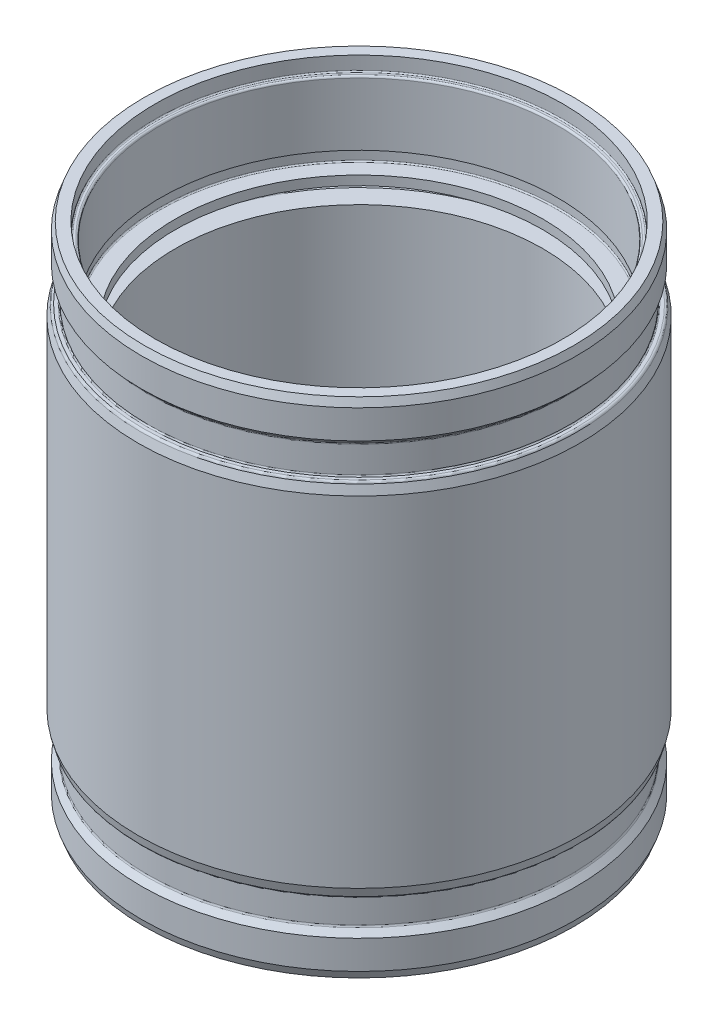
ISO-10303-21;
HEADER;
FILE_DESCRIPTION(('STEP AP214'),'2;1');
FILE_NAME('part.step','',(''),(''),'','','');
FILE_SCHEMA(('AUTOMOTIVE_DESIGN { 1 0 10303 214 1 1 1 1 }'));
ENDSEC;
DATA;
#1=APPLICATION_CONTEXT('core data for automotive mechanical design processes');
#2=APPLICATION_PROTOCOL_DEFINITION('international standard','automotive_design',2000,#1);
#3=PRODUCT_CONTEXT('',#1,'mechanical');
#4=PRODUCT('Part','Part','',(#3));
#5=PRODUCT_RELATED_PRODUCT_CATEGORY('part','',(#4));
#6=PRODUCT_DEFINITION_FORMATION('','',#4);
#7=PRODUCT_DEFINITION_CONTEXT('part definition',#1,'design');
#8=PRODUCT_DEFINITION('design','',#6,#7);
#9=PRODUCT_DEFINITION_SHAPE('','',#8);
#10=(LENGTH_UNIT() NAMED_UNIT(*) SI_UNIT(.MILLI.,.METRE.));
#11=(NAMED_UNIT(*) PLANE_ANGLE_UNIT() SI_UNIT($,.RADIAN.));
#12=(NAMED_UNIT(*) SI_UNIT($,.STERADIAN.) SOLID_ANGLE_UNIT());
#13=UNCERTAINTY_MEASURE_WITH_UNIT(LENGTH_MEASURE(1.E-05),#10,'distance_accuracy_value','');
#14=(GEOMETRIC_REPRESENTATION_CONTEXT(3) GLOBAL_UNCERTAINTY_ASSIGNED_CONTEXT((#13)) GLOBAL_UNIT_ASSIGNED_CONTEXT((#10,
#11,#12)) REPRESENTATION_CONTEXT('',''));
#15=CARTESIAN_POINT('',(0.,0.,0.));
#16=DIRECTION('',(0.,0.,1.));
#17=DIRECTION('',(1.,0.,0.));
#18=AXIS2_PLACEMENT_3D('',#15,#16,#17);
#19=CARTESIAN_POINT('',(0.,0.,0.));
#20=DIRECTION('',(0.,1.,0.));
#21=DIRECTION('',(0.,0.,1.));
#22=AXIS2_PLACEMENT_3D('',#19,#20,#21);
#23=CYLINDRICAL_SURFACE('',#22,59.5);
#24=CARTESIAN_POINT('',(0.,54.45,0.));
#25=DIRECTION('',(0.,1.,0.));
#26=DIRECTION('',(0.,0.,1.));
#27=AXIS2_PLACEMENT_3D('',#24,#25,#26);
#28=CIRCLE('',#27,59.5);
#29=CARTESIAN_POINT('',(0.,54.45,59.5));
#30=VERTEX_POINT('',#29);
#31=EDGE_CURVE('E106',#30,#30,#28,.T.);
#32=ORIENTED_EDGE('',*,*,#31,.F.);
#33=EDGE_LOOP('',(#32));
#34=FACE_BOUND('',#33,.T.);
#35=CARTESIAN_POINT('',(0.,57.45,0.));
#36=DIRECTION('',(0.,1.,0.));
#37=DIRECTION('',(0.,0.,1.));
#38=AXIS2_PLACEMENT_3D('',#35,#36,#37);
#39=CIRCLE('',#38,59.5);
#40=CARTESIAN_POINT('',(0.,57.45,59.5));
#41=VERTEX_POINT('',#40);
#42=EDGE_CURVE('E49',#41,#41,#39,.F.);
#43=ORIENTED_EDGE('',*,*,#42,.F.);
#44=EDGE_LOOP('',(#43));
#45=FACE_BOUND('',#44,.T.);
#46=ADVANCED_FACE('F45',(#34,#45),#23,.F.);
#47=CARTESIAN_POINT('',(59.5,86.5,0.));
#48=DIRECTION('',(0.,-1.,0.));
#49=DIRECTION('',(0.,0.,-1.));
#50=AXIS2_PLACEMENT_3D('',#47,#48,#49);
#51=PLANE('',#50);
#52=CARTESIAN_POINT('',(0.,86.5,0.));
#53=DIRECTION('',(0.,1.,0.));
#54=DIRECTION('',(0.,0.,1.));
#55=AXIS2_PLACEMENT_3D('',#52,#53,#54);
#56=CIRCLE('',#55,69.5789647888592);
#57=CARTESIAN_POINT('',(0.,86.5,69.5789647888592));
#58=VERTEX_POINT('',#57);
#59=EDGE_CURVE('E103',#58,#58,#56,.T.);
#60=ORIENTED_EDGE('',*,*,#59,.T.);
#61=EDGE_LOOP('',(#60));
#62=FACE_BOUND('',#61,.T.);
#63=CARTESIAN_POINT('',(0.,86.5,0.));
#64=DIRECTION('',(0.,1.,0.));
#65=DIRECTION('',(0.,0.,1.));
#66=AXIS2_PLACEMENT_3D('',#63,#64,#65);
#67=CIRCLE('',#66,66.);
#68=CARTESIAN_POINT('',(0.,86.5,66.));
#69=VERTEX_POINT('',#68);
#70=EDGE_CURVE('E772',#69,#69,#67,.T.);
#71=ORIENTED_EDGE('',*,*,#70,.F.);
#72=EDGE_LOOP('',(#71));
#73=FACE_BOUND('',#72,.T.);
#74=ADVANCED_FACE('F214',(#62,#73),#51,.F.);
#75=CARTESIAN_POINT('',(59.5,-76.5000000000001,0.));
#76=DIRECTION('',(0.,1.,0.));
#77=DIRECTION('',(0.,0.,1.));
#78=AXIS2_PLACEMENT_3D('',#75,#76,#77);
#79=PLANE('',#78);
#80=CARTESIAN_POINT('',(0.,-76.5000000000001,0.));
#81=DIRECTION('',(0.,1.,0.));
#82=DIRECTION('',(0.,0.,1.));
#83=AXIS2_PLACEMENT_3D('',#80,#81,#82);
#84=CIRCLE('',#83,69.5789647888592);
#85=CARTESIAN_POINT('',(0.,-76.5000000000001,69.5789647888592));
#86=VERTEX_POINT('',#85);
#87=EDGE_CURVE('E142',#86,#86,#84,.T.);
#88=ORIENTED_EDGE('',*,*,#87,.F.);
#89=EDGE_LOOP('',(#88));
#90=FACE_BOUND('',#89,.T.);
#91=CARTESIAN_POINT('',(0.,-76.5,0.));
#92=DIRECTION('',(0.,1.,0.));
#93=DIRECTION('',(0.,0.,1.));
#94=AXIS2_PLACEMENT_3D('',#91,#92,#93);
#95=CIRCLE('',#94,66.);
#96=CARTESIAN_POINT('',(0.,-76.5,66.));
#97=VERTEX_POINT('',#96);
#98=EDGE_CURVE('E218',#97,#97,#95,.T.);
#99=ORIENTED_EDGE('',*,*,#98,.T.);
#100=EDGE_LOOP('',(#99));
#101=FACE_BOUND('',#100,.T.);
#102=ADVANCED_FACE('F210',(#90,#101),#79,.F.);
#103=CARTESIAN_POINT('',(0.,0.,0.));
#104=DIRECTION('',(0.,1.,0.));
#105=DIRECTION('',(0.,0.,1.));
#106=AXIS2_PLACEMENT_3D('',#103,#104,#105);
#107=CYLINDRICAL_SURFACE('',#106,59.5);
#108=CARTESIAN_POINT('',(0.,-44.45,0.));
#109=DIRECTION('',(0.,1.,0.));
#110=DIRECTION('',(0.,0.,1.));
#111=AXIS2_PLACEMENT_3D('',#108,#109,#110);
#112=CIRCLE('',#111,59.5);
#113=CARTESIAN_POINT('',(0.,-44.45,59.5));
#114=VERTEX_POINT('',#113);
#115=EDGE_CURVE('E139',#114,#114,#112,.T.);
#116=ORIENTED_EDGE('',*,*,#115,.T.);
#117=EDGE_LOOP('',(#116));
#118=FACE_BOUND('',#117,.T.);
#119=CARTESIAN_POINT('',(0.,-47.45,0.));
#120=DIRECTION('',(0.,-1.,0.));
#121=DIRECTION('',(0.,0.,-1.));
#122=AXIS2_PLACEMENT_3D('',#119,#120,#121);
#123=CIRCLE('',#122,59.5);
#124=CARTESIAN_POINT('',(0.,-47.45,-59.5));
#125=VERTEX_POINT('',#124);
#126=EDGE_CURVE('E61',#125,#125,#123,.F.);
#127=ORIENTED_EDGE('',*,*,#126,.F.);
#128=EDGE_LOOP('',(#127));
#129=FACE_BOUND('',#128,.T.);
#130=ADVANCED_FACE('F213',(#118,#129),#107,.F.);
#131=CARTESIAN_POINT('',(0.,-52.857055236082,0.));
#132=DIRECTION('',(0.,1.,0.));
#133=DIRECTION('',(0.,0.,1.));
#134=AXIS2_PLACEMENT_3D('',#131,#132,#133);
#135=CONICAL_SURFACE('',#134,70.7386949873442,0.261799387799153);
#136=CARTESIAN_POINT('',(0.,-50.0158262487937,0.));
#137=DIRECTION('',(0.,1.,0.));
#138=DIRECTION('',(0.,0.,1.));
#139=AXIS2_PLACEMENT_3D('',#136,#137,#138);
#140=CIRCLE('',#139,71.5);
#141=CARTESIAN_POINT('',(0.,-50.0158262487937,71.5));
#142=VERTEX_POINT('',#141);
#143=EDGE_CURVE('E11',#142,#142,#140,.T.);
#144=ORIENTED_EDGE('',*,*,#143,.F.);
#145=EDGE_LOOP('',(#144));
#146=FACE_BOUND('',#145,.T.);
#147=CARTESIAN_POINT('',(0.,-52.857055236082,0.));
#148=DIRECTION('',(0.,1.,0.));
#149=DIRECTION('',(0.,0.,1.));
#150=AXIS2_PLACEMENT_3D('',#147,#148,#149);
#151=CIRCLE('',#150,70.7386949873442);
#152=CARTESIAN_POINT('',(0.,-52.857055236082,70.7386949873442));
#153=VERTEX_POINT('',#152);
#154=EDGE_CURVE('E53',#153,#153,#151,.T.);
#155=ORIENTED_EDGE('',*,*,#154,.T.);
#156=EDGE_LOOP('',(#155));
#157=FACE_BOUND('',#156,.T.);
#158=ADVANCED_FACE('F47',(#146,#157),#135,.T.);
#159=CARTESIAN_POINT('',(0.,-52.65,0.));
#160=DIRECTION('',(0.,1.,0.));
#161=DIRECTION('',(0.,0.,1.));
#162=AXIS2_PLACEMENT_3D('',#159,#160,#161);
#163=TOROIDAL_SURFACE('',#162,69.9659543263129,0.799999999999995);
#164=ORIENTED_EDGE('',*,*,#154,.F.);
#165=EDGE_LOOP('',(#164));
#166=FACE_BOUND('',#165,.T.);
#167=CARTESIAN_POINT('',(0.,-53.45,0.));
#168=DIRECTION('',(0.,1.,0.));
#169=DIRECTION('',(0.,0.,1.));
#170=AXIS2_PLACEMENT_3D('',#167,#168,#169);
#171=CIRCLE('',#170,69.9659543263129);
#172=CARTESIAN_POINT('',(0.,-53.45,69.9659543263129));
#173=VERTEX_POINT('',#172);
#174=EDGE_CURVE('E58',#173,#173,#171,.T.);
#175=ORIENTED_EDGE('',*,*,#174,.T.);
#176=EDGE_LOOP('',(#175));
#177=FACE_BOUND('',#176,.T.);
#178=ADVANCED_FACE('F165',(#166,#177),#163,.T.);
#179=CARTESIAN_POINT('',(69.9659543263129,-53.45,0.));
#180=DIRECTION('',(0.,1.,0.));
#181=DIRECTION('',(0.,0.,1.));
#182=AXIS2_PLACEMENT_3D('',#179,#180,#181);
#183=PLANE('',#182);
#184=ORIENTED_EDGE('',*,*,#174,.F.);
#185=EDGE_LOOP('',(#184));
#186=FACE_BOUND('',#185,.T.);
#187=CARTESIAN_POINT('',(0.,-53.45,0.));
#188=DIRECTION('',(0.,1.,0.));
#189=DIRECTION('',(0.,0.,1.));
#190=AXIS2_PLACEMENT_3D('',#187,#188,#189);
#191=CIRCLE('',#190,68.9);
#192=CARTESIAN_POINT('',(0.,-53.45,68.9));
#193=VERTEX_POINT('',#192);
#194=EDGE_CURVE('E160',#193,#193,#191,.T.);
#195=ORIENTED_EDGE('',*,*,#194,.T.);
#196=EDGE_LOOP('',(#195));
#197=FACE_BOUND('',#196,.T.);
#198=ADVANCED_FACE('F167',(#186,#197),#183,.F.);
#199=CARTESIAN_POINT('',(0.,-53.85,0.));
#200=DIRECTION('',(0.,1.,0.));
#201=DIRECTION('',(0.,0.,1.));
#202=AXIS2_PLACEMENT_3D('',#199,#200,#201);
#203=TOROIDAL_SURFACE('',#202,68.9,0.399999999999994);
#204=ORIENTED_EDGE('',*,*,#194,.F.);
#205=EDGE_LOOP('',(#204));
#206=FACE_BOUND('',#205,.T.);
#207=CARTESIAN_POINT('',(0.,-53.85,0.));
#208=DIRECTION('',(0.,1.,0.));
#209=DIRECTION('',(0.,0.,1.));
#210=AXIS2_PLACEMENT_3D('',#207,#208,#209);
#211=CIRCLE('',#210,68.5);
#212=CARTESIAN_POINT('',(0.,-53.85,68.5));
#213=VERTEX_POINT('',#212);
#214=EDGE_CURVE('E157',#213,#213,#211,.T.);
#215=ORIENTED_EDGE('',*,*,#214,.T.);
#216=EDGE_LOOP('',(#215));
#217=FACE_BOUND('',#216,.T.);
#218=ADVANCED_FACE('F170',(#206,#217),#203,.F.);
#219=CARTESIAN_POINT('',(0.,0.,0.));
#220=DIRECTION('',(0.,1.,0.));
#221=DIRECTION('',(0.,0.,1.));
#222=AXIS2_PLACEMENT_3D('',#219,#220,#221);
#223=CYLINDRICAL_SURFACE('',#222,68.5);
#224=ORIENTED_EDGE('',*,*,#214,.F.);
#225=EDGE_LOOP('',(#224));
#226=FACE_BOUND('',#225,.T.);
#227=CARTESIAN_POINT('',(0.,-62.436522368915,0.));
#228=DIRECTION('',(0.,1.,0.));
#229=DIRECTION('',(0.,0.,1.));
#230=AXIS2_PLACEMENT_3D('',#227,#228,#229);
#231=CIRCLE('',#230,68.5);
#232=CARTESIAN_POINT('',(0.,-62.436522368915,68.5));
#233=VERTEX_POINT('',#232);
#234=EDGE_CURVE('E154',#233,#233,#231,.T.);
#235=ORIENTED_EDGE('',*,*,#234,.T.);
#236=EDGE_LOOP('',(#235));
#237=FACE_BOUND('',#236,.T.);
#238=ADVANCED_FACE('F176',(#226,#237),#223,.T.);
#239=CARTESIAN_POINT('',(0.,-62.436522368915,0.));
#240=DIRECTION('',(0.,1.,0.));
#241=DIRECTION('',(0.,0.,1.));
#242=AXIS2_PLACEMENT_3D('',#239,#240,#241);
#243=TOROIDAL_SURFACE('',#242,69.3,0.799999999999998);
#244=ORIENTED_EDGE('',*,*,#234,.F.);
#245=EDGE_LOOP('',(#244));
#246=FACE_BOUND('',#245,.T.);
#247=CARTESIAN_POINT('',(0.,-63.0022077938642,0.));
#248=DIRECTION('',(0.,1.,0.));
#249=DIRECTION('',(0.,0.,1.));
#250=AXIS2_PLACEMENT_3D('',#247,#248,#249);
#251=CIRCLE('',#250,68.7343145750508);
#252=CARTESIAN_POINT('',(0.,-63.0022077938642,68.7343145750508));
#253=VERTEX_POINT('',#252);
#254=EDGE_CURVE('E151',#253,#253,#251,.T.);
#255=ORIENTED_EDGE('',*,*,#254,.T.);
#256=EDGE_LOOP('',(#255));
#257=FACE_BOUND('',#256,.T.);
#258=ADVANCED_FACE('F182',(#246,#257),#243,.F.);
#259=CARTESIAN_POINT('',(0.,-64.7428932188135,0.));
#260=DIRECTION('',(0.,-1.,0.));
#261=DIRECTION('',(0.,0.,-1.));
#262=AXIS2_PLACEMENT_3D('',#259,#260,#261);
#263=CONICAL_SURFACE('',#262,70.475,0.785398163397448);
#264=ORIENTED_EDGE('',*,*,#254,.F.);
#265=EDGE_LOOP('',(#264));
#266=FACE_BOUND('',#265,.T.);
#267=CARTESIAN_POINT('',(0.,-64.7428932188135,0.));
#268=DIRECTION('',(0.,1.,0.));
#269=DIRECTION('',(0.,0.,1.));
#270=AXIS2_PLACEMENT_3D('',#267,#268,#269);
#271=CIRCLE('',#270,70.475);
#272=CARTESIAN_POINT('',(0.,-64.7428932188135,70.475));
#273=VERTEX_POINT('',#272);
#274=EDGE_CURVE('E148',#273,#273,#271,.T.);
#275=ORIENTED_EDGE('',*,*,#274,.T.);
#276=EDGE_LOOP('',(#275));
#277=FACE_BOUND('',#276,.T.);
#278=ADVANCED_FACE('F188',(#266,#277),#263,.T.);
#279=CARTESIAN_POINT('',(0.,0.,0.));
#280=DIRECTION('',(0.,1.,0.));
#281=DIRECTION('',(0.,0.,1.));
#282=AXIS2_PLACEMENT_3D('',#279,#280,#281);
#283=CYLINDRICAL_SURFACE('',#282,70.475);
#284=ORIENTED_EDGE('',*,*,#274,.F.);
#285=EDGE_LOOP('',(#284));
#286=FACE_BOUND('',#285,.T.);
#287=CARTESIAN_POINT('',(0.,-74.0381634903542,0.));
#288=DIRECTION('',(0.,1.,0.));
#289=DIRECTION('',(0.,0.,1.));
#290=AXIS2_PLACEMENT_3D('',#287,#288,#289);
#291=CIRCLE('',#290,70.475);
#292=CARTESIAN_POINT('',(0.,-74.0381634903542,70.475));
#293=VERTEX_POINT('',#292);
#294=EDGE_CURVE('E145',#293,#293,#291,.T.);
#295=ORIENTED_EDGE('',*,*,#294,.T.);
#296=EDGE_LOOP('',(#295));
#297=FACE_BOUND('',#296,.T.);
#298=ADVANCED_FACE('F194',(#286,#297),#283,.T.);
#299=CARTESIAN_POINT('',(0.,-76.5000000000001,0.));
#300=DIRECTION('',(0.,1.,0.));
#301=DIRECTION('',(0.,0.,1.));
#302=AXIS2_PLACEMENT_3D('',#299,#300,#301);
#303=CONICAL_SURFACE('',#302,69.5789647888592,0.349065850398851);
#304=ORIENTED_EDGE('',*,*,#294,.F.);
#305=EDGE_LOOP('',(#304));
#306=FACE_BOUND('',#305,.T.);
#307=ORIENTED_EDGE('',*,*,#87,.T.);
#308=EDGE_LOOP('',(#307));
#309=FACE_BOUND('',#308,.T.);
#310=ADVANCED_FACE('F200',(#306,#309),#303,.T.);
#311=CARTESIAN_POINT('',(59.5,-44.45,0.));
#312=DIRECTION('',(0.,-1.,0.));
#313=DIRECTION('',(0.,0.,-1.));
#314=AXIS2_PLACEMENT_3D('',#311,#312,#313);
#315=PLANE('',#314);
#316=ORIENTED_EDGE('',*,*,#115,.F.);
#317=EDGE_LOOP('',(#316));
#318=FACE_BOUND('',#317,.T.);
#319=CARTESIAN_POINT('',(0.,-44.45,0.));
#320=DIRECTION('',(0.,1.,0.));
#321=DIRECTION('',(0.,0.,1.));
#322=AXIS2_PLACEMENT_3D('',#319,#320,#321);
#323=CIRCLE('',#322,66.25);
#324=CARTESIAN_POINT('',(0.,-44.45,66.25));
#325=VERTEX_POINT('',#324);
#326=EDGE_CURVE('E136',#325,#325,#323,.T.);
#327=ORIENTED_EDGE('',*,*,#326,.T.);
#328=EDGE_LOOP('',(#327));
#329=FACE_BOUND('',#328,.T.);
#330=ADVANCED_FACE('F206',(#318,#329),#315,.F.);
#331=CARTESIAN_POINT('',(0.,-43.65,0.));
#332=DIRECTION('',(0.,1.,0.));
#333=DIRECTION('',(0.,0.,1.));
#334=AXIS2_PLACEMENT_3D('',#331,#332,#333);
#335=TOROIDAL_SURFACE('',#334,66.25,0.799999999999999);
#336=ORIENTED_EDGE('',*,*,#326,.F.);
#337=EDGE_LOOP('',(#336));
#338=FACE_BOUND('',#337,.T.);
#339=CARTESIAN_POINT('',(0.,-43.65,0.));
#340=DIRECTION('',(0.,1.,0.));
#341=DIRECTION('',(0.,0.,1.));
#342=AXIS2_PLACEMENT_3D('',#339,#340,#341);
#343=CIRCLE('',#342,67.05);
#344=CARTESIAN_POINT('',(0.,-43.65,67.05));
#345=VERTEX_POINT('',#344);
#346=EDGE_CURVE('E133',#345,#345,#343,.T.);
#347=ORIENTED_EDGE('',*,*,#346,.T.);
#348=EDGE_LOOP('',(#347));
#349=FACE_BOUND('',#348,.T.);
#350=ADVANCED_FACE('F308',(#338,#349),#335,.F.);
#351=CARTESIAN_POINT('',(0.,0.,0.));
#352=DIRECTION('',(0.,1.,0.));
#353=DIRECTION('',(0.,0.,1.));
#354=AXIS2_PLACEMENT_3D('',#351,#352,#353);
#355=CYLINDRICAL_SURFACE('',#354,67.05);
#356=ORIENTED_EDGE('',*,*,#346,.F.);
#357=EDGE_LOOP('',(#356));
#358=FACE_BOUND('',#357,.T.);
#359=CARTESIAN_POINT('',(0.,-39.95,0.));
#360=DIRECTION('',(0.,1.,0.));
#361=DIRECTION('',(0.,0.,1.));
#362=AXIS2_PLACEMENT_3D('',#359,#360,#361);
#363=CIRCLE('',#362,67.05);
#364=CARTESIAN_POINT('',(0.,-39.95,67.05));
#365=VERTEX_POINT('',#364);
#366=EDGE_CURVE('E130',#365,#365,#363,.T.);
#367=ORIENTED_EDGE('',*,*,#366,.T.);
#368=EDGE_LOOP('',(#367));
#369=FACE_BOUND('',#368,.T.);
#370=ADVANCED_FACE('F304',(#358,#369),#355,.F.);
#371=CARTESIAN_POINT('',(0.,-39.95,0.));
#372=DIRECTION('',(0.,1.,0.));
#373=DIRECTION('',(0.,0.,1.));
#374=AXIS2_PLACEMENT_3D('',#371,#372,#373);
#375=TOROIDAL_SURFACE('',#374,66.25,0.799999999999999);
#376=ORIENTED_EDGE('',*,*,#366,.F.);
#377=EDGE_LOOP('',(#376));
#378=FACE_BOUND('',#377,.T.);
#379=CARTESIAN_POINT('',(0.,-39.15,0.));
#380=DIRECTION('',(0.,1.,0.));
#381=DIRECTION('',(0.,0.,1.));
#382=AXIS2_PLACEMENT_3D('',#379,#380,#381);
#383=CIRCLE('',#382,66.25);
#384=CARTESIAN_POINT('',(0.,-39.15,66.25));
#385=VERTEX_POINT('',#384);
#386=EDGE_CURVE('E127',#385,#385,#383,.T.);
#387=ORIENTED_EDGE('',*,*,#386,.T.);
#388=EDGE_LOOP('',(#387));
#389=FACE_BOUND('',#388,.T.);
#390=ADVANCED_FACE('F300',(#378,#389),#375,.F.);
#391=CARTESIAN_POINT('',(66.25,-39.15,0.));
#392=DIRECTION('',(0.,1.,0.));
#393=DIRECTION('',(0.,0.,1.));
#394=AXIS2_PLACEMENT_3D('',#391,#392,#393);
#395=PLANE('',#394);
#396=ORIENTED_EDGE('',*,*,#386,.F.);
#397=EDGE_LOOP('',(#396));
#398=FACE_BOUND('',#397,.T.);
#399=CARTESIAN_POINT('',(0.,-39.15,0.));
#400=DIRECTION('',(0.,1.,0.));
#401=DIRECTION('',(0.,0.,1.));
#402=AXIS2_PLACEMENT_3D('',#399,#400,#401);
#403=CIRCLE('',#402,59.5);
#404=CARTESIAN_POINT('',(0.,-39.15,59.5));
#405=VERTEX_POINT('',#404);
#406=EDGE_CURVE('E124',#405,#405,#403,.T.);
#407=ORIENTED_EDGE('',*,*,#406,.T.);
#408=EDGE_LOOP('',(#407));
#409=FACE_BOUND('',#408,.T.);
#410=ADVANCED_FACE('F296',(#398,#409),#395,.F.);
#411=CARTESIAN_POINT('',(0.,0.,0.));
#412=DIRECTION('',(0.,1.,0.));
#413=DIRECTION('',(0.,0.,1.));
#414=AXIS2_PLACEMENT_3D('',#411,#412,#413);
#415=CYLINDRICAL_SURFACE('',#414,59.5);
#416=ORIENTED_EDGE('',*,*,#406,.F.);
#417=EDGE_LOOP('',(#416));
#418=FACE_BOUND('',#417,.T.);
#419=CARTESIAN_POINT('',(0.,49.15,0.));
#420=DIRECTION('',(0.,1.,0.));
#421=DIRECTION('',(0.,0.,1.));
#422=AXIS2_PLACEMENT_3D('',#419,#420,#421);
#423=CIRCLE('',#422,59.5);
#424=CARTESIAN_POINT('',(0.,49.15,59.5));
#425=VERTEX_POINT('',#424);
#426=EDGE_CURVE('E121',#425,#425,#423,.T.);
#427=ORIENTED_EDGE('',*,*,#426,.T.);
#428=EDGE_LOOP('',(#427));
#429=FACE_BOUND('',#428,.T.);
#430=ADVANCED_FACE('F292',(#418,#429),#415,.F.);
#431=CARTESIAN_POINT('',(66.25,49.15,0.));
#432=DIRECTION('',(0.,-1.,0.));
#433=DIRECTION('',(0.,0.,-1.));
#434=AXIS2_PLACEMENT_3D('',#431,#432,#433);
#435=PLANE('',#434);
#436=ORIENTED_EDGE('',*,*,#426,.F.);
#437=EDGE_LOOP('',(#436));
#438=FACE_BOUND('',#437,.T.);
#439=CARTESIAN_POINT('',(0.,49.1499999999999,0.));
#440=DIRECTION('',(0.,1.,0.));
#441=DIRECTION('',(0.,0.,1.));
#442=AXIS2_PLACEMENT_3D('',#439,#440,#441);
#443=CIRCLE('',#442,66.25);
#444=CARTESIAN_POINT('',(0.,49.1499999999999,66.25));
#445=VERTEX_POINT('',#444);
#446=EDGE_CURVE('E118',#445,#445,#443,.T.);
#447=ORIENTED_EDGE('',*,*,#446,.T.);
#448=EDGE_LOOP('',(#447));
#449=FACE_BOUND('',#448,.T.);
#450=ADVANCED_FACE('F288',(#438,#449),#435,.F.);
#451=CARTESIAN_POINT('',(0.,49.9499999999999,0.));
#452=DIRECTION('',(0.,1.,0.));
#453=DIRECTION('',(0.,0.,1.));
#454=AXIS2_PLACEMENT_3D('',#451,#452,#453);
#455=TOROIDAL_SURFACE('',#454,66.25,0.799999999999999);
#456=ORIENTED_EDGE('',*,*,#446,.F.);
#457=EDGE_LOOP('',(#456));
#458=FACE_BOUND('',#457,.T.);
#459=CARTESIAN_POINT('',(0.,49.9499999999999,0.));
#460=DIRECTION('',(0.,1.,0.));
#461=DIRECTION('',(0.,0.,1.));
#462=AXIS2_PLACEMENT_3D('',#459,#460,#461);
#463=CIRCLE('',#462,67.05);
#464=CARTESIAN_POINT('',(0.,49.9499999999999,67.05));
#465=VERTEX_POINT('',#464);
#466=EDGE_CURVE('E115',#465,#465,#463,.T.);
#467=ORIENTED_EDGE('',*,*,#466,.T.);
#468=EDGE_LOOP('',(#467));
#469=FACE_BOUND('',#468,.T.);
#470=ADVANCED_FACE('F284',(#458,#469),#455,.F.);
#471=CARTESIAN_POINT('',(0.,0.,0.));
#472=DIRECTION('',(0.,1.,0.));
#473=DIRECTION('',(0.,0.,1.));
#474=AXIS2_PLACEMENT_3D('',#471,#472,#473);
#475=CYLINDRICAL_SURFACE('',#474,67.05);
#476=ORIENTED_EDGE('',*,*,#466,.F.);
#477=EDGE_LOOP('',(#476));
#478=FACE_BOUND('',#477,.T.);
#479=CARTESIAN_POINT('',(0.,53.6499999999999,0.));
#480=DIRECTION('',(0.,1.,0.));
#481=DIRECTION('',(0.,0.,1.));
#482=AXIS2_PLACEMENT_3D('',#479,#480,#481);
#483=CIRCLE('',#482,67.05);
#484=CARTESIAN_POINT('',(0.,53.6499999999999,67.05));
#485=VERTEX_POINT('',#484);
#486=EDGE_CURVE('E112',#485,#485,#483,.T.);
#487=ORIENTED_EDGE('',*,*,#486,.T.);
#488=EDGE_LOOP('',(#487));
#489=FACE_BOUND('',#488,.T.);
#490=ADVANCED_FACE('F280',(#478,#489),#475,.F.);
#491=CARTESIAN_POINT('',(0.,53.6499999999999,0.));
#492=DIRECTION('',(0.,1.,0.));
#493=DIRECTION('',(0.,0.,1.));
#494=AXIS2_PLACEMENT_3D('',#491,#492,#493);
#495=TOROIDAL_SURFACE('',#494,66.25,0.799999999999999);
#496=ORIENTED_EDGE('',*,*,#486,.F.);
#497=EDGE_LOOP('',(#496));
#498=FACE_BOUND('',#497,.T.);
#499=CARTESIAN_POINT('',(0.,54.4499999999999,0.));
#500=DIRECTION('',(0.,1.,0.));
#501=DIRECTION('',(0.,0.,1.));
#502=AXIS2_PLACEMENT_3D('',#499,#500,#501);
#503=CIRCLE('',#502,66.25);
#504=CARTESIAN_POINT('',(0.,54.4499999999999,66.25));
#505=VERTEX_POINT('',#504);
#506=EDGE_CURVE('E109',#505,#505,#503,.T.);
#507=ORIENTED_EDGE('',*,*,#506,.T.);
#508=EDGE_LOOP('',(#507));
#509=FACE_BOUND('',#508,.T.);
#510=ADVANCED_FACE('F276',(#498,#509),#495,.F.);
#511=CARTESIAN_POINT('',(59.5,54.45,0.));
#512=DIRECTION('',(0.,1.,0.));
#513=DIRECTION('',(0.,0.,1.));
#514=AXIS2_PLACEMENT_3D('',#511,#512,#513);
#515=PLANE('',#514);
#516=ORIENTED_EDGE('',*,*,#506,.F.);
#517=EDGE_LOOP('',(#516));
#518=FACE_BOUND('',#517,.T.);
#519=ORIENTED_EDGE('',*,*,#31,.T.);
#520=EDGE_LOOP('',(#519));
#521=FACE_BOUND('',#520,.T.);
#522=ADVANCED_FACE('F272',(#518,#521),#515,.F.);
#523=CARTESIAN_POINT('',(0.,84.0381634903543,0.));
#524=DIRECTION('',(0.,-1.,0.));
#525=DIRECTION('',(0.,0.,-1.));
#526=AXIS2_PLACEMENT_3D('',#523,#524,#525);
#527=CONICAL_SURFACE('',#526,70.475,0.349065850398841);
#528=ORIENTED_EDGE('',*,*,#59,.F.);
#529=EDGE_LOOP('',(#528));
#530=FACE_BOUND('',#529,.T.);
#531=CARTESIAN_POINT('',(0.,84.0381634903543,0.));
#532=DIRECTION('',(0.,1.,0.));
#533=DIRECTION('',(0.,0.,1.));
#534=AXIS2_PLACEMENT_3D('',#531,#532,#533);
#535=CIRCLE('',#534,70.475);
#536=CARTESIAN_POINT('',(0.,84.0381634903543,70.475));
#537=VERTEX_POINT('',#536);
#538=EDGE_CURVE('E100',#537,#537,#535,.T.);
#539=ORIENTED_EDGE('',*,*,#538,.T.);
#540=EDGE_LOOP('',(#539));
#541=FACE_BOUND('',#540,.T.);
#542=ADVANCED_FACE('F275',(#530,#541),#527,.T.);
#543=CARTESIAN_POINT('',(0.,0.,0.));
#544=DIRECTION('',(0.,1.,0.));
#545=DIRECTION('',(0.,0.,1.));
#546=AXIS2_PLACEMENT_3D('',#543,#544,#545);
#547=CYLINDRICAL_SURFACE('',#546,70.475);
#548=ORIENTED_EDGE('',*,*,#538,.F.);
#549=EDGE_LOOP('',(#548));
#550=FACE_BOUND('',#549,.T.);
#551=CARTESIAN_POINT('',(0.,74.7428932188134,0.));
#552=DIRECTION('',(0.,1.,0.));
#553=DIRECTION('',(0.,0.,1.));
#554=AXIS2_PLACEMENT_3D('',#551,#552,#553);
#555=CIRCLE('',#554,70.475);
#556=CARTESIAN_POINT('',(0.,74.7428932188134,70.475));
#557=VERTEX_POINT('',#556);
#558=EDGE_CURVE('E97',#557,#557,#555,.T.);
#559=ORIENTED_EDGE('',*,*,#558,.T.);
#560=EDGE_LOOP('',(#559));
#561=FACE_BOUND('',#560,.T.);
#562=ADVANCED_FACE('F453',(#550,#561),#547,.T.);
#563=CARTESIAN_POINT('',(0.,73.0022077938641,0.));
#564=DIRECTION('',(0.,1.,0.));
#565=DIRECTION('',(0.,0.,1.));
#566=AXIS2_PLACEMENT_3D('',#563,#564,#565);
#567=CONICAL_SURFACE('',#566,68.7343145750508,0.785398163397448);
#568=ORIENTED_EDGE('',*,*,#558,.F.);
#569=EDGE_LOOP('',(#568));
#570=FACE_BOUND('',#569,.T.);
#571=CARTESIAN_POINT('',(0.,73.0022077938641,0.));
#572=DIRECTION('',(0.,1.,0.));
#573=DIRECTION('',(0.,0.,1.));
#574=AXIS2_PLACEMENT_3D('',#571,#572,#573);
#575=CIRCLE('',#574,68.7343145750508);
#576=CARTESIAN_POINT('',(0.,73.0022077938641,68.7343145750508));
#577=VERTEX_POINT('',#576);
#578=EDGE_CURVE('E94',#577,#577,#575,.T.);
#579=ORIENTED_EDGE('',*,*,#578,.T.);
#580=EDGE_LOOP('',(#579));
#581=FACE_BOUND('',#580,.T.);
#582=ADVANCED_FACE('F462',(#570,#581),#567,.T.);
#583=CARTESIAN_POINT('',(0.,72.4365223689149,0.));
#584=DIRECTION('',(0.,1.,0.));
#585=DIRECTION('',(0.,0.,1.));
#586=AXIS2_PLACEMENT_3D('',#583,#584,#585);
#587=TOROIDAL_SURFACE('',#586,69.3,0.799999999999998);
#588=ORIENTED_EDGE('',*,*,#578,.F.);
#589=EDGE_LOOP('',(#588));
#590=FACE_BOUND('',#589,.T.);
#591=CARTESIAN_POINT('',(0.,72.4365223689149,0.));
#592=DIRECTION('',(0.,1.,0.));
#593=DIRECTION('',(0.,0.,1.));
#594=AXIS2_PLACEMENT_3D('',#591,#592,#593);
#595=CIRCLE('',#594,68.5);
#596=CARTESIAN_POINT('',(0.,72.4365223689149,68.5));
#597=VERTEX_POINT('',#596);
#598=EDGE_CURVE('E91',#597,#597,#595,.T.);
#599=ORIENTED_EDGE('',*,*,#598,.T.);
#600=EDGE_LOOP('',(#599));
#601=FACE_BOUND('',#600,.T.);
#602=ADVANCED_FACE('F475',(#590,#601),#587,.F.);
#603=CARTESIAN_POINT('',(0.,0.,0.));
#604=DIRECTION('',(0.,1.,0.));
#605=DIRECTION('',(0.,0.,1.));
#606=AXIS2_PLACEMENT_3D('',#603,#604,#605);
#607=CYLINDRICAL_SURFACE('',#606,68.5);
#608=ORIENTED_EDGE('',*,*,#598,.F.);
#609=EDGE_LOOP('',(#608));
#610=FACE_BOUND('',#609,.T.);
#611=CARTESIAN_POINT('',(0.,63.8499999999999,0.));
#612=DIRECTION('',(0.,1.,0.));
#613=DIRECTION('',(0.,0.,1.));
#614=AXIS2_PLACEMENT_3D('',#611,#612,#613);
#615=CIRCLE('',#614,68.5);
#616=CARTESIAN_POINT('',(0.,63.8499999999999,68.5));
#617=VERTEX_POINT('',#616);
#618=EDGE_CURVE('E88',#617,#617,#615,.T.);
#619=ORIENTED_EDGE('',*,*,#618,.T.);
#620=EDGE_LOOP('',(#619));
#621=FACE_BOUND('',#620,.T.);
#622=ADVANCED_FACE('F485',(#610,#621),#607,.T.);
#623=CARTESIAN_POINT('',(0.,63.8499999999999,0.));
#624=DIRECTION('',(0.,1.,0.));
#625=DIRECTION('',(0.,0.,1.));
#626=AXIS2_PLACEMENT_3D('',#623,#624,#625);
#627=TOROIDAL_SURFACE('',#626,68.9,0.399999999999998);
#628=ORIENTED_EDGE('',*,*,#618,.F.);
#629=EDGE_LOOP('',(#628));
#630=FACE_BOUND('',#629,.T.);
#631=CARTESIAN_POINT('',(0.,63.4499999999999,0.));
#632=DIRECTION('',(0.,1.,0.));
#633=DIRECTION('',(0.,0.,1.));
#634=AXIS2_PLACEMENT_3D('',#631,#632,#633);
#635=CIRCLE('',#634,68.9);
#636=CARTESIAN_POINT('',(0.,63.4499999999999,68.9));
#637=VERTEX_POINT('',#636);
#638=EDGE_CURVE('E85',#637,#637,#635,.T.);
#639=ORIENTED_EDGE('',*,*,#638,.T.);
#640=EDGE_LOOP('',(#639));
#641=FACE_BOUND('',#640,.T.);
#642=ADVANCED_FACE('F495',(#630,#641),#627,.F.);
#643=CARTESIAN_POINT('',(69.9659543263129,63.4499999999999,0.));
#644=DIRECTION('',(0.,-1.,0.));
#645=DIRECTION('',(0.,0.,-1.));
#646=AXIS2_PLACEMENT_3D('',#643,#644,#645);
#647=PLANE('',#646);
#648=ORIENTED_EDGE('',*,*,#638,.F.);
#649=EDGE_LOOP('',(#648));
#650=FACE_BOUND('',#649,.T.);
#651=CARTESIAN_POINT('',(0.,63.4499999999999,0.));
#652=DIRECTION('',(0.,1.,0.));
#653=DIRECTION('',(0.,0.,1.));
#654=AXIS2_PLACEMENT_3D('',#651,#652,#653);
#655=CIRCLE('',#654,69.9659543263129);
#656=CARTESIAN_POINT('',(0.,63.4499999999999,69.9659543263129));
#657=VERTEX_POINT('',#656);
#658=EDGE_CURVE('E82',#657,#657,#655,.T.);
#659=ORIENTED_EDGE('',*,*,#658,.T.);
#660=EDGE_LOOP('',(#659));
#661=FACE_BOUND('',#660,.T.);
#662=ADVANCED_FACE('F505',(#650,#661),#647,.F.);
#663=CARTESIAN_POINT('',(0.,62.6499999999999,0.));
#664=DIRECTION('',(0.,1.,0.));
#665=DIRECTION('',(0.,0.,1.));
#666=AXIS2_PLACEMENT_3D('',#663,#664,#665);
#667=TOROIDAL_SURFACE('',#666,69.9659543263129,0.800000000000029);
#668=ORIENTED_EDGE('',*,*,#658,.F.);
#669=EDGE_LOOP('',(#668));
#670=FACE_BOUND('',#669,.T.);
#671=CARTESIAN_POINT('',(0.,62.8570552360821,0.));
#672=DIRECTION('',(0.,1.,0.));
#673=DIRECTION('',(0.,0.,1.));
#674=AXIS2_PLACEMENT_3D('',#671,#672,#673);
#675=CIRCLE('',#674,70.7386949873442);
#676=CARTESIAN_POINT('',(0.,62.8570552360821,70.7386949873442));
#677=VERTEX_POINT('',#676);
#678=EDGE_CURVE('E68',#677,#677,#675,.T.);
#679=ORIENTED_EDGE('',*,*,#678,.T.);
#680=EDGE_LOOP('',(#679));
#681=FACE_BOUND('',#680,.T.);
#682=ADVANCED_FACE('F515',(#670,#681),#667,.T.);
#683=CARTESIAN_POINT('',(0.,60.0158262487937,0.));
#684=DIRECTION('',(0.,-1.,0.));
#685=DIRECTION('',(0.,0.,-1.));
#686=AXIS2_PLACEMENT_3D('',#683,#684,#685);
#687=CONICAL_SURFACE('',#686,71.5,0.261799387799148);
#688=ORIENTED_EDGE('',*,*,#678,.F.);
#689=EDGE_LOOP('',(#688));
#690=FACE_BOUND('',#689,.T.);
#691=CARTESIAN_POINT('',(0.,60.0158262487937,0.));
#692=DIRECTION('',(0.,1.,0.));
#693=DIRECTION('',(0.,0.,1.));
#694=AXIS2_PLACEMENT_3D('',#691,#692,#693);
#695=CIRCLE('',#694,71.5);
#696=CARTESIAN_POINT('',(0.,60.0158262487937,71.5));
#697=VERTEX_POINT('',#696);
#698=EDGE_CURVE('E63',#697,#697,#695,.T.);
#699=ORIENTED_EDGE('',*,*,#698,.T.);
#700=EDGE_LOOP('',(#699));
#701=FACE_BOUND('',#700,.T.);
#702=ADVANCED_FACE('F525',(#690,#701),#687,.T.);
#703=CARTESIAN_POINT('',(0.,0.,0.));
#704=DIRECTION('',(0.,1.,0.));
#705=DIRECTION('',(0.,0.,1.));
#706=AXIS2_PLACEMENT_3D('',#703,#704,#705);
#707=CYLINDRICAL_SURFACE('',#706,71.5);
#708=ORIENTED_EDGE('',*,*,#698,.F.);
#709=EDGE_LOOP('',(#708));
#710=FACE_BOUND('',#709,.T.);
#711=ORIENTED_EDGE('',*,*,#143,.T.);
#712=EDGE_LOOP('',(#711));
#713=FACE_BOUND('',#712,.T.);
#714=ADVANCED_FACE('F535',(#710,#713),#707,.T.);
#715=CARTESIAN_POINT('',(58.8156371003785,-47.45,0.));
#716=DIRECTION('',(0.,-1.,0.));
#717=DIRECTION('',(0.,0.,-1.));
#718=AXIS2_PLACEMENT_3D('',#715,#716,#717);
#719=PLANE('',#718);
#720=CARTESIAN_POINT('',(0.,-47.45,0.));
#721=DIRECTION('',(0.,1.,0.));
#722=DIRECTION('',(0.,0.,1.));
#723=AXIS2_PLACEMENT_3D('',#720,#721,#722);
#724=CIRCLE('',#723,64.5);
#725=CARTESIAN_POINT('',(0.,-47.45,64.5));
#726=VERTEX_POINT('',#725);
#727=EDGE_CURVE('E64',#726,#726,#724,.T.);
#728=ORIENTED_EDGE('',*,*,#727,.F.);
#729=EDGE_LOOP('',(#728));
#730=FACE_BOUND('',#729,.T.);
#731=ORIENTED_EDGE('',*,*,#126,.T.);
#732=EDGE_LOOP('',(#731));
#733=FACE_BOUND('',#732,.T.);
#734=ADVANCED_FACE('F257',(#730,#733),#719,.T.);
#735=CARTESIAN_POINT('',(0.,-47.85,0.));
#736=DIRECTION('',(0.,1.,0.));
#737=DIRECTION('',(0.,0.,1.));
#738=AXIS2_PLACEMENT_3D('',#735,#736,#737);
#739=TOROIDAL_SURFACE('',#738,64.5,0.399999999999998);
#740=ORIENTED_EDGE('',*,*,#727,.T.);
#741=EDGE_LOOP('',(#740));
#742=FACE_BOUND('',#741,.T.);
#743=CARTESIAN_POINT('',(0.,-47.85,0.));
#744=DIRECTION('',(0.,1.,0.));
#745=DIRECTION('',(0.,0.,1.));
#746=AXIS2_PLACEMENT_3D('',#743,#744,#745);
#747=CIRCLE('',#746,64.9);
#748=CARTESIAN_POINT('',(0.,-47.85,64.9));
#749=VERTEX_POINT('',#748);
#750=EDGE_CURVE('E71',#749,#749,#747,.T.);
#751=ORIENTED_EDGE('',*,*,#750,.F.);
#752=EDGE_LOOP('',(#751));
#753=FACE_BOUND('',#752,.T.);
#754=ADVANCED_FACE('F248',(#742,#753),#739,.F.);
#755=CARTESIAN_POINT('',(0.,0.,0.));
#756=DIRECTION('',(0.,1.,0.));
#757=DIRECTION('',(0.,0.,1.));
#758=AXIS2_PLACEMENT_3D('',#755,#756,#757);
#759=CYLINDRICAL_SURFACE('',#758,64.9);
#760=ORIENTED_EDGE('',*,*,#750,.T.);
#761=EDGE_LOOP('',(#760));
#762=FACE_BOUND('',#761,.T.);
#763=CARTESIAN_POINT('',(0.,-51.,0.));
#764=DIRECTION('',(0.,1.,0.));
#765=DIRECTION('',(0.,0.,1.));
#766=AXIS2_PLACEMENT_3D('',#763,#764,#765);
#767=CIRCLE('',#766,64.9);
#768=CARTESIAN_POINT('',(0.,-51.,64.9));
#769=VERTEX_POINT('',#768);
#770=EDGE_CURVE('E76',#769,#769,#767,.T.);
#771=ORIENTED_EDGE('',*,*,#770,.F.);
#772=EDGE_LOOP('',(#771));
#773=FACE_BOUND('',#772,.T.);
#774=ADVANCED_FACE('F246',(#762,#773),#759,.F.);
#775=CARTESIAN_POINT('',(64.3,-51.,0.));
#776=DIRECTION('',(0.,1.,0.));
#777=DIRECTION('',(0.,0.,1.));
#778=AXIS2_PLACEMENT_3D('',#775,#776,#777);
#779=PLANE('',#778);
#780=ORIENTED_EDGE('',*,*,#770,.T.);
#781=EDGE_LOOP('',(#780));
#782=FACE_BOUND('',#781,.T.);
#783=CARTESIAN_POINT('',(0.,-51.,0.));
#784=DIRECTION('',(0.,1.,0.));
#785=DIRECTION('',(0.,0.,1.));
#786=AXIS2_PLACEMENT_3D('',#783,#784,#785);
#787=CIRCLE('',#786,64.3);
#788=CARTESIAN_POINT('',(0.,-51.,64.3));
#789=VERTEX_POINT('',#788);
#790=EDGE_CURVE('E238',#789,#789,#787,.T.);
#791=ORIENTED_EDGE('',*,*,#790,.F.);
#792=EDGE_LOOP('',(#791));
#793=FACE_BOUND('',#792,.T.);
#794=ADVANCED_FACE('F243',(#782,#793),#779,.T.);
#795=CARTESIAN_POINT('',(0.,0.,0.));
#796=DIRECTION('',(0.,1.,0.));
#797=DIRECTION('',(0.,0.,1.));
#798=AXIS2_PLACEMENT_3D('',#795,#796,#797);
#799=CYLINDRICAL_SURFACE('',#798,64.3);
#800=ORIENTED_EDGE('',*,*,#790,.T.);
#801=EDGE_LOOP('',(#800));
#802=FACE_BOUND('',#801,.T.);
#803=CARTESIAN_POINT('',(0.,-71.25,0.));
#804=DIRECTION('',(0.,1.,0.));
#805=DIRECTION('',(0.,0.,1.));
#806=AXIS2_PLACEMENT_3D('',#803,#804,#805);
#807=CIRCLE('',#806,64.3);
#808=CARTESIAN_POINT('',(0.,-71.25,64.3));
#809=VERTEX_POINT('',#808);
#810=EDGE_CURVE('E235',#809,#809,#807,.T.);
#811=ORIENTED_EDGE('',*,*,#810,.F.);
#812=EDGE_LOOP('',(#811));
#813=FACE_BOUND('',#812,.T.);
#814=ADVANCED_FACE('F255',(#802,#813),#799,.F.);
#815=CARTESIAN_POINT('',(0.,-71.25,0.));
#816=DIRECTION('',(0.,1.,0.));
#817=DIRECTION('',(0.,0.,1.));
#818=AXIS2_PLACEMENT_3D('',#815,#816,#817);
#819=TOROIDAL_SURFACE('',#818,64.9,0.600000000000003);
#820=ORIENTED_EDGE('',*,*,#810,.T.);
#821=EDGE_LOOP('',(#820));
#822=FACE_BOUND('',#821,.T.);
#823=CARTESIAN_POINT('',(0.,-71.85,0.));
#824=DIRECTION('',(0.,1.,0.));
#825=DIRECTION('',(0.,0.,1.));
#826=AXIS2_PLACEMENT_3D('',#823,#824,#825);
#827=CIRCLE('',#826,64.9);
#828=CARTESIAN_POINT('',(0.,-71.85,64.9));
#829=VERTEX_POINT('',#828);
#830=EDGE_CURVE('E232',#829,#829,#827,.T.);
#831=ORIENTED_EDGE('',*,*,#830,.F.);
#832=EDGE_LOOP('',(#831));
#833=FACE_BOUND('',#832,.T.);
#834=ADVANCED_FACE('F603',(#822,#833),#819,.T.);
#835=CARTESIAN_POINT('',(64.9,-71.85,0.));
#836=DIRECTION('',(0.,-1.,0.));
#837=DIRECTION('',(0.,0.,-1.));
#838=AXIS2_PLACEMENT_3D('',#835,#836,#837);
#839=PLANE('',#838);
#840=ORIENTED_EDGE('',*,*,#830,.T.);
#841=EDGE_LOOP('',(#840));
#842=FACE_BOUND('',#841,.T.);
#843=CARTESIAN_POINT('',(0.,-71.85,0.));
#844=DIRECTION('',(0.,1.,0.));
#845=DIRECTION('',(0.,0.,1.));
#846=AXIS2_PLACEMENT_3D('',#843,#844,#845);
#847=CIRCLE('',#846,65.6);
#848=CARTESIAN_POINT('',(0.,-71.85,65.6));
#849=VERTEX_POINT('',#848);
#850=EDGE_CURVE('E223',#849,#849,#847,.T.);
#851=ORIENTED_EDGE('',*,*,#850,.F.);
#852=EDGE_LOOP('',(#851));
#853=FACE_BOUND('',#852,.T.);
#854=ADVANCED_FACE('F619',(#842,#853),#839,.T.);
#855=CARTESIAN_POINT('',(0.,-72.25,0.));
#856=DIRECTION('',(0.,1.,0.));
#857=DIRECTION('',(0.,0.,1.));
#858=AXIS2_PLACEMENT_3D('',#855,#856,#857);
#859=TOROIDAL_SURFACE('',#858,65.6,0.399999999999998);
#860=ORIENTED_EDGE('',*,*,#850,.T.);
#861=EDGE_LOOP('',(#860));
#862=FACE_BOUND('',#861,.T.);
#863=CARTESIAN_POINT('',(0.,-72.25,0.));
#864=DIRECTION('',(0.,1.,0.));
#865=DIRECTION('',(0.,0.,1.));
#866=AXIS2_PLACEMENT_3D('',#863,#864,#865);
#867=CIRCLE('',#866,66.);
#868=CARTESIAN_POINT('',(0.,-72.25,66.));
#869=VERTEX_POINT('',#868);
#870=EDGE_CURVE('E220',#869,#869,#867,.T.);
#871=ORIENTED_EDGE('',*,*,#870,.F.);
#872=EDGE_LOOP('',(#871));
#873=FACE_BOUND('',#872,.T.);
#874=ADVANCED_FACE('F629',(#862,#873),#859,.F.);
#875=CARTESIAN_POINT('',(0.,0.,0.));
#876=DIRECTION('',(0.,1.,0.));
#877=DIRECTION('',(0.,0.,1.));
#878=AXIS2_PLACEMENT_3D('',#875,#876,#877);
#879=CYLINDRICAL_SURFACE('',#878,66.);
#880=ORIENTED_EDGE('',*,*,#870,.T.);
#881=EDGE_LOOP('',(#880));
#882=FACE_BOUND('',#881,.T.);
#883=ORIENTED_EDGE('',*,*,#98,.F.);
#884=EDGE_LOOP('',(#883));
#885=FACE_BOUND('',#884,.T.);
#886=ADVANCED_FACE('F639',(#882,#885),#879,.F.);
#887=CARTESIAN_POINT('',(58.8156371003785,57.45,0.));
#888=DIRECTION('',(0.,1.,0.));
#889=DIRECTION('',(0.,0.,1.));
#890=AXIS2_PLACEMENT_3D('',#887,#888,#889);
#891=PLANE('',#890);
#892=CARTESIAN_POINT('',(0.,57.45,0.));
#893=DIRECTION('',(0.,1.,0.));
#894=DIRECTION('',(0.,0.,1.));
#895=AXIS2_PLACEMENT_3D('',#892,#893,#894);
#896=CIRCLE('',#895,64.5);
#897=CARTESIAN_POINT('',(0.,57.45,64.5));
#898=VERTEX_POINT('',#897);
#899=EDGE_CURVE('E770',#898,#898,#896,.T.);
#900=ORIENTED_EDGE('',*,*,#899,.T.);
#901=EDGE_LOOP('',(#900));
#902=FACE_BOUND('',#901,.T.);
#903=ORIENTED_EDGE('',*,*,#42,.T.);
#904=EDGE_LOOP('',(#903));
#905=FACE_BOUND('',#904,.T.);
#906=ADVANCED_FACE('F649',(#902,#905),#891,.T.);
#907=CARTESIAN_POINT('',(0.,82.25,0.));
#908=DIRECTION('',(0.,1.,0.));
#909=DIRECTION('',(0.,0.,1.));
#910=AXIS2_PLACEMENT_3D('',#907,#908,#909);
#911=TOROIDAL_SURFACE('',#910,65.6,0.400000000000011);
#912=CARTESIAN_POINT('',(0.,82.25,0.));
#913=DIRECTION('',(0.,1.,0.));
#914=DIRECTION('',(0.,0.,1.));
#915=AXIS2_PLACEMENT_3D('',#912,#913,#914);
#916=CIRCLE('',#915,66.);
#917=CARTESIAN_POINT('',(0.,82.25,66.));
#918=VERTEX_POINT('',#917);
#919=EDGE_CURVE('E226',#918,#918,#916,.T.);
#920=ORIENTED_EDGE('',*,*,#919,.T.);
#921=EDGE_LOOP('',(#920));
#922=FACE_BOUND('',#921,.T.);
#923=CARTESIAN_POINT('',(0.,81.85,0.));
#924=DIRECTION('',(0.,1.,0.));
#925=DIRECTION('',(0.,0.,1.));
#926=AXIS2_PLACEMENT_3D('',#923,#924,#925);
#927=CIRCLE('',#926,65.6);
#928=CARTESIAN_POINT('',(0.,81.85,65.6));
#929=VERTEX_POINT('',#928);
#930=EDGE_CURVE('E751',#929,#929,#927,.T.);
#931=ORIENTED_EDGE('',*,*,#930,.F.);
#932=EDGE_LOOP('',(#931));
#933=FACE_BOUND('',#932,.T.);
#934=ADVANCED_FACE('F659',(#922,#933),#911,.F.);
#935=CARTESIAN_POINT('',(0.,0.,0.));
#936=DIRECTION('',(0.,1.,0.));
#937=DIRECTION('',(0.,0.,1.));
#938=AXIS2_PLACEMENT_3D('',#935,#936,#937);
#939=CYLINDRICAL_SURFACE('',#938,66.);
#940=ORIENTED_EDGE('',*,*,#70,.T.);
#941=EDGE_LOOP('',(#940));
#942=FACE_BOUND('',#941,.T.);
#943=ORIENTED_EDGE('',*,*,#919,.F.);
#944=EDGE_LOOP('',(#943));
#945=FACE_BOUND('',#944,.T.);
#946=ADVANCED_FACE('F669',(#942,#945),#939,.F.);
#947=CARTESIAN_POINT('',(0.,57.85,0.));
#948=DIRECTION('',(0.,1.,0.));
#949=DIRECTION('',(0.,0.,1.));
#950=AXIS2_PLACEMENT_3D('',#947,#948,#949);
#951=TOROIDAL_SURFACE('',#950,64.5,0.399999999999998);
#952=CARTESIAN_POINT('',(0.,57.85,0.));
#953=DIRECTION('',(0.,1.,0.));
#954=DIRECTION('',(0.,0.,1.));
#955=AXIS2_PLACEMENT_3D('',#952,#953,#954);
#956=CIRCLE('',#955,64.9);
#957=CARTESIAN_POINT('',(0.,57.85,64.9));
#958=VERTEX_POINT('',#957);
#959=EDGE_CURVE('E767',#958,#958,#956,.T.);
#960=ORIENTED_EDGE('',*,*,#959,.T.);
#961=EDGE_LOOP('',(#960));
#962=FACE_BOUND('',#961,.T.);
#963=ORIENTED_EDGE('',*,*,#899,.F.);
#964=EDGE_LOOP('',(#963));
#965=FACE_BOUND('',#964,.T.);
#966=ADVANCED_FACE('F679',(#962,#965),#951,.F.);
#967=CARTESIAN_POINT('',(0.,0.,0.));
#968=DIRECTION('',(0.,1.,0.));
#969=DIRECTION('',(0.,0.,1.));
#970=AXIS2_PLACEMENT_3D('',#967,#968,#969);
#971=CYLINDRICAL_SURFACE('',#970,64.9);
#972=CARTESIAN_POINT('',(0.,61.,0.));
#973=DIRECTION('',(0.,1.,0.));
#974=DIRECTION('',(0.,0.,1.));
#975=AXIS2_PLACEMENT_3D('',#972,#973,#974);
#976=CIRCLE('',#975,64.9);
#977=CARTESIAN_POINT('',(0.,61.,64.9));
#978=VERTEX_POINT('',#977);
#979=EDGE_CURVE('E764',#978,#978,#976,.T.);
#980=ORIENTED_EDGE('',*,*,#979,.T.);
#981=EDGE_LOOP('',(#980));
#982=FACE_BOUND('',#981,.T.);
#983=ORIENTED_EDGE('',*,*,#959,.F.);
#984=EDGE_LOOP('',(#983));
#985=FACE_BOUND('',#984,.T.);
#986=ADVANCED_FACE('F689',(#982,#985),#971,.F.);
#987=CARTESIAN_POINT('',(64.3,61.,0.));
#988=DIRECTION('',(0.,-1.,0.));
#989=DIRECTION('',(0.,0.,-1.));
#990=AXIS2_PLACEMENT_3D('',#987,#988,#989);
#991=PLANE('',#990);
#992=CARTESIAN_POINT('',(0.,61.,0.));
#993=DIRECTION('',(0.,1.,0.));
#994=DIRECTION('',(0.,0.,1.));
#995=AXIS2_PLACEMENT_3D('',#992,#993,#994);
#996=CIRCLE('',#995,64.3);
#997=CARTESIAN_POINT('',(0.,61.,64.3));
#998=VERTEX_POINT('',#997);
#999=EDGE_CURVE('E758',#998,#998,#996,.T.);
#1000=ORIENTED_EDGE('',*,*,#999,.T.);
#1001=EDGE_LOOP('',(#1000));
#1002=FACE_BOUND('',#1001,.T.);
#1003=ORIENTED_EDGE('',*,*,#979,.F.);
#1004=EDGE_LOOP('',(#1003));
#1005=FACE_BOUND('',#1004,.T.);
#1006=ADVANCED_FACE('F699',(#1002,#1005),#991,.T.);
#1007=CARTESIAN_POINT('',(0.,0.,0.));
#1008=DIRECTION('',(0.,1.,0.));
#1009=DIRECTION('',(0.,0.,1.));
#1010=AXIS2_PLACEMENT_3D('',#1007,#1008,#1009);
#1011=CYLINDRICAL_SURFACE('',#1010,64.3);
#1012=CARTESIAN_POINT('',(0.,81.25,0.));
#1013=DIRECTION('',(0.,1.,0.));
#1014=DIRECTION('',(0.,0.,1.));
#1015=AXIS2_PLACEMENT_3D('',#1012,#1013,#1014);
#1016=CIRCLE('',#1015,64.3);
#1017=CARTESIAN_POINT('',(0.,81.25,64.3));
#1018=VERTEX_POINT('',#1017);
#1019=EDGE_CURVE('E755',#1018,#1018,#1016,.T.);
#1020=ORIENTED_EDGE('',*,*,#1019,.T.);
#1021=EDGE_LOOP('',(#1020));
#1022=FACE_BOUND('',#1021,.T.);
#1023=ORIENTED_EDGE('',*,*,#999,.F.);
#1024=EDGE_LOOP('',(#1023));
#1025=FACE_BOUND('',#1024,.T.);
#1026=ADVANCED_FACE('F709',(#1022,#1025),#1011,.F.);
#1027=CARTESIAN_POINT('',(0.,81.25,0.));
#1028=DIRECTION('',(0.,1.,0.));
#1029=DIRECTION('',(0.,0.,1.));
#1030=AXIS2_PLACEMENT_3D('',#1027,#1028,#1029);
#1031=TOROIDAL_SURFACE('',#1030,64.9,0.599999999999989);
#1032=CARTESIAN_POINT('',(0.,81.85,0.));
#1033=DIRECTION('',(0.,1.,0.));
#1034=DIRECTION('',(0.,0.,1.));
#1035=AXIS2_PLACEMENT_3D('',#1032,#1033,#1034);
#1036=CIRCLE('',#1035,64.9);
#1037=CARTESIAN_POINT('',(0.,81.85,64.9));
#1038=VERTEX_POINT('',#1037);
#1039=EDGE_CURVE('E754',#1038,#1038,#1036,.T.);
#1040=ORIENTED_EDGE('',*,*,#1039,.T.);
#1041=EDGE_LOOP('',(#1040));
#1042=FACE_BOUND('',#1041,.T.);
#1043=ORIENTED_EDGE('',*,*,#1019,.F.);
#1044=EDGE_LOOP('',(#1043));
#1045=FACE_BOUND('',#1044,.T.);
#1046=ADVANCED_FACE('F719',(#1042,#1045),#1031,.T.);
#1047=CARTESIAN_POINT('',(64.9,81.85,0.));
#1048=DIRECTION('',(0.,1.,0.));
#1049=DIRECTION('',(0.,0.,1.));
#1050=AXIS2_PLACEMENT_3D('',#1047,#1048,#1049);
#1051=PLANE('',#1050);
#1052=ORIENTED_EDGE('',*,*,#930,.T.);
#1053=EDGE_LOOP('',(#1052));
#1054=FACE_BOUND('',#1053,.T.);
#1055=ORIENTED_EDGE('',*,*,#1039,.F.);
#1056=EDGE_LOOP('',(#1055));
#1057=FACE_BOUND('',#1056,.T.);
#1058=ADVANCED_FACE('F735',(#1054,#1057),#1051,.T.);
#1059=CLOSED_SHELL('',(#46,#74,#102,#130,#158,#178,#198,#218,#238,#258,#278,#298,#310,#330,#350,
#370,#390,#410,#430,#450,#470,#490,#510,#522,#542,#562,#582,#602,#622,#642,#662,#682,#702,#714,
#734,#754,#774,#794,#814,#834,#854,#874,#886,#906,#934,#946,#966,#986,#1006,#1026,#1046,#1058));
#1060=MANIFOLD_SOLID_BREP('B2',#1059);
#1061=ADVANCED_BREP_SHAPE_REPRESENTATION('',(#18,#1060),#14);
#1062=SHAPE_DEFINITION_REPRESENTATION(#9,#1061);
ENDSEC;
END-ISO-10303-21;
